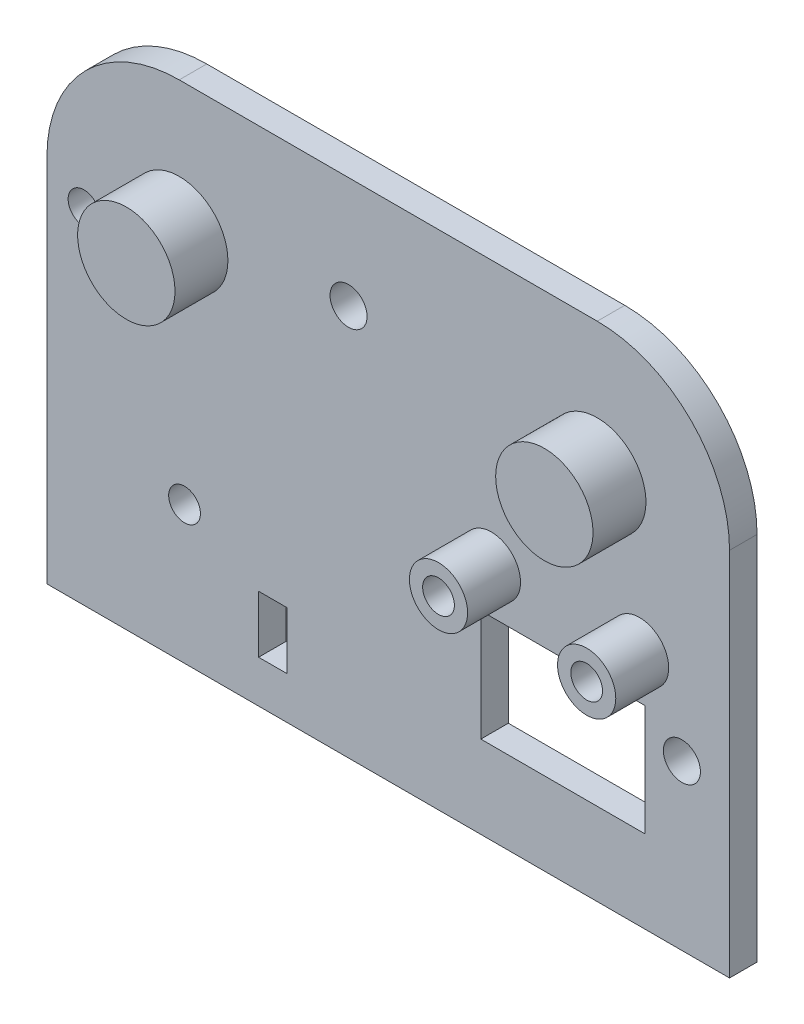
ISO-10303-21;
HEADER;
FILE_DESCRIPTION(('STEP AP214'),'2;1');
FILE_NAME('part.step','',(''),(''),'','','');
FILE_SCHEMA(('AUTOMOTIVE_DESIGN { 1 0 10303 214 1 1 1 1 }'));
ENDSEC;
DATA;
#1=APPLICATION_CONTEXT('core data for automotive mechanical design processes');
#2=APPLICATION_PROTOCOL_DEFINITION('international standard','automotive_design',2000,#1);
#3=PRODUCT_CONTEXT('',#1,'mechanical');
#4=PRODUCT('Part','Part','',(#3));
#5=PRODUCT_RELATED_PRODUCT_CATEGORY('part','',(#4));
#6=PRODUCT_DEFINITION_FORMATION('','',#4);
#7=PRODUCT_DEFINITION_CONTEXT('part definition',#1,'design');
#8=PRODUCT_DEFINITION('design','',#6,#7);
#9=PRODUCT_DEFINITION_SHAPE('','',#8);
#10=(LENGTH_UNIT() NAMED_UNIT(*) SI_UNIT(.MILLI.,.METRE.));
#11=(NAMED_UNIT(*) PLANE_ANGLE_UNIT() SI_UNIT($,.RADIAN.));
#12=(NAMED_UNIT(*) SI_UNIT($,.STERADIAN.) SOLID_ANGLE_UNIT());
#13=UNCERTAINTY_MEASURE_WITH_UNIT(LENGTH_MEASURE(1.E-05),#10,'distance_accuracy_value','');
#14=(GEOMETRIC_REPRESENTATION_CONTEXT(3) GLOBAL_UNCERTAINTY_ASSIGNED_CONTEXT((#13)) GLOBAL_UNIT_ASSIGNED_CONTEXT((#10,
#11,#12)) REPRESENTATION_CONTEXT('',''));
#15=CARTESIAN_POINT('',(0.,0.,0.));
#16=DIRECTION('',(0.,0.,1.));
#17=DIRECTION('',(1.,0.,0.));
#18=AXIS2_PLACEMENT_3D('',#15,#16,#17);
#19=CARTESIAN_POINT('',(-32.25,23.75,2.6));
#20=DIRECTION('',(1.,0.,0.));
#21=DIRECTION('',(0.,0.,-1.));
#22=AXIS2_PLACEMENT_3D('',#19,#20,#21);
#23=PLANE('',#22);
#24=DIRECTION('',(0.,-1.,0.));
#25=VECTOR('',#24,1.);
#26=CARTESIAN_POINT('',(-32.25,23.75,2.6));
#27=LINE('',#26,#25);
#28=CARTESIAN_POINT('',(-32.25,11.25,2.6));
#29=VERTEX_POINT('',#28);
#30=CARTESIAN_POINT('',(-32.25,-23.75,2.6));
#31=VERTEX_POINT('',#30);
#32=EDGE_CURVE('E229',#29,#31,#27,.T.);
#33=ORIENTED_EDGE('',*,*,#32,.F.);
#34=DIRECTION('',(0.,0.,-1.));
#35=VECTOR('',#34,1.);
#36=CARTESIAN_POINT('',(-32.25,11.25,2.6));
#37=LINE('',#36,#35);
#38=CARTESIAN_POINT('',(-32.25,11.25,0.));
#39=VERTEX_POINT('',#38);
#40=EDGE_CURVE('E11',#29,#39,#37,.T.);
#41=ORIENTED_EDGE('',*,*,#40,.T.);
#42=DIRECTION('',(0.,-1.,0.));
#43=VECTOR('',#42,1.);
#44=CARTESIAN_POINT('',(-32.25,23.75,0.));
#45=LINE('',#44,#43);
#46=CARTESIAN_POINT('',(-32.25,-23.75,0.));
#47=VERTEX_POINT('',#46);
#48=EDGE_CURVE('E226',#39,#47,#45,.T.);
#49=ORIENTED_EDGE('',*,*,#48,.T.);
#50=DIRECTION('',(0.,0.,-1.));
#51=VECTOR('',#50,1.);
#52=CARTESIAN_POINT('',(-32.25,-23.75,2.6));
#53=LINE('',#52,#51);
#54=EDGE_CURVE('E251',#31,#47,#53,.T.);
#55=ORIENTED_EDGE('',*,*,#54,.F.);
#56=EDGE_LOOP('',(#33,#41,#49,#55));
#57=FACE_BOUND('',#56,.T.);
#58=ADVANCED_FACE('F41',(#57),#23,.F.);
#59=CARTESIAN_POINT('',(-32.25,-23.75,2.6));
#60=DIRECTION('',(0.,1.,0.));
#61=DIRECTION('',(0.,0.,1.));
#62=AXIS2_PLACEMENT_3D('',#59,#60,#61);
#63=PLANE('',#62);
#64=DIRECTION('',(1.,0.,0.));
#65=VECTOR('',#64,1.);
#66=CARTESIAN_POINT('',(-32.25,-23.75,0.));
#67=LINE('',#66,#65);
#68=CARTESIAN_POINT('',(32.25,-23.75,0.));
#69=VERTEX_POINT('',#68);
#70=EDGE_CURVE('E242',#47,#69,#67,.T.);
#71=ORIENTED_EDGE('',*,*,#70,.T.);
#72=DIRECTION('',(0.,0.,-1.));
#73=VECTOR('',#72,1.);
#74=CARTESIAN_POINT('',(32.25,-23.75,2.6));
#75=LINE('',#74,#73);
#76=CARTESIAN_POINT('',(32.25,-23.75,2.6));
#77=VERTEX_POINT('',#76);
#78=EDGE_CURVE('E240',#77,#69,#75,.T.);
#79=ORIENTED_EDGE('',*,*,#78,.F.);
#80=DIRECTION('',(1.,0.,0.));
#81=VECTOR('',#80,1.);
#82=CARTESIAN_POINT('',(-32.25,-23.75,2.6));
#83=LINE('',#82,#81);
#84=EDGE_CURVE('E231',#31,#77,#83,.T.);
#85=ORIENTED_EDGE('',*,*,#84,.F.);
#86=ORIENTED_EDGE('',*,*,#54,.T.);
#87=EDGE_LOOP('',(#71,#79,#85,#86));
#88=FACE_BOUND('',#87,.T.);
#89=ADVANCED_FACE('F355',(#88),#63,.F.);
#90=CARTESIAN_POINT('',(32.25,23.75,2.6));
#91=DIRECTION('',(-1.,0.,0.));
#92=DIRECTION('',(0.,-1.,0.));
#93=AXIS2_PLACEMENT_3D('',#90,#91,#92);
#94=PLANE('',#93);
#95=DIRECTION('',(0.,1.,0.));
#96=VECTOR('',#95,1.);
#97=CARTESIAN_POINT('',(32.25,23.75,0.));
#98=LINE('',#97,#96);
#99=CARTESIAN_POINT('',(32.25,11.25,0.));
#100=VERTEX_POINT('',#99);
#101=EDGE_CURVE('E244',#69,#100,#98,.T.);
#102=ORIENTED_EDGE('',*,*,#101,.T.);
#103=DIRECTION('',(0.,0.,-1.));
#104=VECTOR('',#103,1.);
#105=CARTESIAN_POINT('',(32.25,11.25,2.6));
#106=LINE('',#105,#104);
#107=CARTESIAN_POINT('',(32.25,11.25,2.6));
#108=VERTEX_POINT('',#107);
#109=EDGE_CURVE('E263',#100,#108,#106,.F.);
#110=ORIENTED_EDGE('',*,*,#109,.T.);
#111=DIRECTION('',(0.,1.,0.));
#112=VECTOR('',#111,1.);
#113=CARTESIAN_POINT('',(32.25,23.75,2.6));
#114=LINE('',#113,#112);
#115=EDGE_CURVE('E234',#77,#108,#114,.T.);
#116=ORIENTED_EDGE('',*,*,#115,.F.);
#117=ORIENTED_EDGE('',*,*,#78,.T.);
#118=EDGE_LOOP('',(#102,#110,#116,#117));
#119=FACE_BOUND('',#118,.T.);
#120=ADVANCED_FACE('F362',(#119),#94,.F.);
#121=CARTESIAN_POINT('',(-32.25,23.75,2.6));
#122=DIRECTION('',(0.,-1.,0.));
#123=DIRECTION('',(0.,0.,-1.));
#124=AXIS2_PLACEMENT_3D('',#121,#122,#123);
#125=PLANE('',#124);
#126=DIRECTION('',(-1.,0.,0.));
#127=VECTOR('',#126,1.);
#128=CARTESIAN_POINT('',(-32.25,23.75,2.6));
#129=LINE('',#128,#127);
#130=CARTESIAN_POINT('',(19.75,23.75,2.6));
#131=VERTEX_POINT('',#130);
#132=CARTESIAN_POINT('',(-19.75,23.75,2.6));
#133=VERTEX_POINT('',#132);
#134=EDGE_CURVE('E237',#131,#133,#129,.T.);
#135=ORIENTED_EDGE('',*,*,#134,.F.);
#136=DIRECTION('',(0.,0.,-1.));
#137=VECTOR('',#136,1.);
#138=CARTESIAN_POINT('',(19.75,23.75,2.6));
#139=LINE('',#138,#137);
#140=CARTESIAN_POINT('',(19.75,23.75,0.));
#141=VERTEX_POINT('',#140);
#142=EDGE_CURVE('E256',#131,#141,#139,.T.);
#143=ORIENTED_EDGE('',*,*,#142,.T.);
#144=DIRECTION('',(-1.,0.,0.));
#145=VECTOR('',#144,1.);
#146=CARTESIAN_POINT('',(-32.25,23.75,0.));
#147=LINE('',#146,#145);
#148=CARTESIAN_POINT('',(-19.75,23.75,0.));
#149=VERTEX_POINT('',#148);
#150=EDGE_CURVE('E232',#141,#149,#147,.T.);
#151=ORIENTED_EDGE('',*,*,#150,.T.);
#152=DIRECTION('',(0.,0.,-1.));
#153=VECTOR('',#152,1.);
#154=CARTESIAN_POINT('',(-19.75,23.75,2.6));
#155=LINE('',#154,#153);
#156=EDGE_CURVE('E254',#149,#133,#155,.F.);
#157=ORIENTED_EDGE('',*,*,#156,.T.);
#158=EDGE_LOOP('',(#135,#143,#151,#157));
#159=FACE_BOUND('',#158,.T.);
#160=ADVANCED_FACE('F343',(#159),#125,.F.);
#161=CARTESIAN_POINT('',(0.,0.,2.6));
#162=DIRECTION('',(0.,0.,1.));
#163=DIRECTION('',(1.,0.,0.));
#164=AXIS2_PLACEMENT_3D('',#161,#162,#163);
#165=PLANE('',#164);
#166=CARTESIAN_POINT('',(-19.75,11.25,2.6));
#167=DIRECTION('',(0.,0.,1.));
#168=DIRECTION('',(1.,0.,0.));
#169=AXIS2_PLACEMENT_3D('',#166,#167,#168);
#170=CIRCLE('',#169,4.6);
#171=CARTESIAN_POINT('',(-15.15,11.25,2.6));
#172=VERTEX_POINT('',#171);
#173=EDGE_CURVE('E288',#172,#172,#170,.T.);
#174=ORIENTED_EDGE('',*,*,#173,.F.);
#175=EDGE_LOOP('',(#174));
#176=FACE_BOUND('',#175,.T.);
#177=CARTESIAN_POINT('',(23.75,-1.25,2.6));
#178=DIRECTION('',(0.,0.,1.));
#179=DIRECTION('',(1.,0.,0.));
#180=AXIS2_PLACEMENT_3D('',#177,#178,#179);
#181=CIRCLE('',#180,2.75);
#182=CARTESIAN_POINT('',(26.5,-1.25,2.6));
#183=VERTEX_POINT('',#182);
#184=EDGE_CURVE('E276',#183,#183,#181,.T.);
#185=ORIENTED_EDGE('',*,*,#184,.F.);
#186=EDGE_LOOP('',(#185));
#187=FACE_BOUND('',#186,.T.);
#188=CARTESIAN_POINT('',(9.75000000000001,-1.25,2.6));
#189=DIRECTION('',(0.,0.,1.));
#190=DIRECTION('',(1.,0.,0.));
#191=AXIS2_PLACEMENT_3D('',#188,#189,#190);
#192=CIRCLE('',#191,2.75);
#193=CARTESIAN_POINT('',(12.5,-1.25,2.6));
#194=VERTEX_POINT('',#193);
#195=EDGE_CURVE('E292',#194,#194,#192,.T.);
#196=ORIENTED_EDGE('',*,*,#195,.F.);
#197=EDGE_LOOP('',(#196));
#198=FACE_BOUND('',#197,.T.);
#199=CARTESIAN_POINT('',(19.75,11.25,2.6));
#200=DIRECTION('',(0.,0.,1.));
#201=DIRECTION('',(-1.,0.,0.));
#202=AXIS2_PLACEMENT_3D('',#199,#200,#201);
#203=CIRCLE('',#202,4.6);
#204=CARTESIAN_POINT('',(15.15,11.25,2.6));
#205=VERTEX_POINT('',#204);
#206=EDGE_CURVE('E285',#205,#205,#203,.T.);
#207=ORIENTED_EDGE('',*,*,#206,.F.);
#208=EDGE_LOOP('',(#207));
#209=FACE_BOUND('',#208,.T.);
#210=CARTESIAN_POINT('',(27.75,-8.25,2.6));
#211=DIRECTION('',(0.,0.,1.));
#212=DIRECTION('',(1.,0.,0.));
#213=AXIS2_PLACEMENT_3D('',#210,#211,#212);
#214=CIRCLE('',#213,1.75);
#215=CARTESIAN_POINT('',(29.5,-8.25,2.6));
#216=VERTEX_POINT('',#215);
#217=EDGE_CURVE('E151',#216,#216,#214,.T.);
#218=ORIENTED_EDGE('',*,*,#217,.F.);
#219=EDGE_LOOP('',(#218));
#220=FACE_BOUND('',#219,.T.);
#221=DIRECTION('',(0.,-1.,0.));
#222=VECTOR('',#221,1.);
#223=CARTESIAN_POINT('',(-12.25,-14.35,2.6));
#224=LINE('',#223,#222);
#225=CARTESIAN_POINT('',(-12.25,-14.35,2.6));
#226=VERTEX_POINT('',#225);
#227=CARTESIAN_POINT('',(-12.25,-19.75,2.6));
#228=VERTEX_POINT('',#227);
#229=EDGE_CURVE('E58',#226,#228,#224,.T.);
#230=ORIENTED_EDGE('',*,*,#229,.F.);
#231=DIRECTION('',(-1.,0.,0.));
#232=VECTOR('',#231,1.);
#233=CARTESIAN_POINT('',(-12.25,-14.35,2.6));
#234=LINE('',#233,#232);
#235=CARTESIAN_POINT('',(-9.55,-14.35,2.6));
#236=VERTEX_POINT('',#235);
#237=EDGE_CURVE('E154',#236,#226,#234,.T.);
#238=ORIENTED_EDGE('',*,*,#237,.F.);
#239=DIRECTION('',(0.,1.,0.));
#240=VECTOR('',#239,1.);
#241=CARTESIAN_POINT('',(-9.55,-14.35,2.6));
#242=LINE('',#241,#240);
#243=CARTESIAN_POINT('',(-9.55,-19.75,2.6));
#244=VERTEX_POINT('',#243);
#245=EDGE_CURVE('E159',#244,#236,#242,.T.);
#246=ORIENTED_EDGE('',*,*,#245,.F.);
#247=DIRECTION('',(1.,0.,0.));
#248=VECTOR('',#247,1.);
#249=CARTESIAN_POINT('',(-12.25,-19.75,2.6));
#250=LINE('',#249,#248);
#251=EDGE_CURVE('E165',#228,#244,#250,.T.);
#252=ORIENTED_EDGE('',*,*,#251,.F.);
#253=EDGE_LOOP('',(#230,#238,#246,#252));
#254=FACE_BOUND('',#253,.T.);
#255=DIRECTION('',(0.,-1.,0.));
#256=VECTOR('',#255,1.);
#257=CARTESIAN_POINT('',(8.75000000000001,-5.45,2.6));
#258=LINE('',#257,#256);
#259=CARTESIAN_POINT('',(8.75000000000001,-5.45,2.6));
#260=VERTEX_POINT('',#259);
#261=CARTESIAN_POINT('',(8.75000000000001,-15.95,2.6));
#262=VERTEX_POINT('',#261);
#263=EDGE_CURVE('E66',#260,#262,#258,.T.);
#264=ORIENTED_EDGE('',*,*,#263,.F.);
#265=DIRECTION('',(-1.,0.,0.));
#266=VECTOR('',#265,1.);
#267=CARTESIAN_POINT('',(8.75000000000001,-5.45,2.6));
#268=LINE('',#267,#266);
#269=CARTESIAN_POINT('',(24.25,-5.45,2.6));
#270=VERTEX_POINT('',#269);
#271=EDGE_CURVE('E202',#270,#260,#268,.T.);
#272=ORIENTED_EDGE('',*,*,#271,.F.);
#273=DIRECTION('',(0.,1.,0.));
#274=VECTOR('',#273,1.);
#275=CARTESIAN_POINT('',(24.25,-5.45,2.6));
#276=LINE('',#275,#274);
#277=CARTESIAN_POINT('',(24.25,-15.95,2.6));
#278=VERTEX_POINT('',#277);
#279=EDGE_CURVE('E205',#278,#270,#276,.T.);
#280=ORIENTED_EDGE('',*,*,#279,.F.);
#281=DIRECTION('',(1.,0.,0.));
#282=VECTOR('',#281,1.);
#283=CARTESIAN_POINT('',(8.75000000000001,-15.95,2.6));
#284=LINE('',#283,#282);
#285=EDGE_CURVE('E209',#262,#278,#284,.T.);
#286=ORIENTED_EDGE('',*,*,#285,.F.);
#287=EDGE_LOOP('',(#264,#272,#280,#286));
#288=FACE_BOUND('',#287,.T.);
#289=CARTESIAN_POINT('',(-28.75,8.75,2.6));
#290=DIRECTION('',(0.,0.,1.));
#291=DIRECTION('',(1.,0.,0.));
#292=AXIS2_PLACEMENT_3D('',#289,#290,#291);
#293=CIRCLE('',#292,1.5);
#294=CARTESIAN_POINT('',(-27.25,8.75,2.6));
#295=VERTEX_POINT('',#294);
#296=EDGE_CURVE('E189',#295,#295,#293,.T.);
#297=ORIENTED_EDGE('',*,*,#296,.F.);
#298=EDGE_LOOP('',(#297));
#299=FACE_BOUND('',#298,.T.);
#300=CARTESIAN_POINT('',(-3.74999999999999,13.25,2.6));
#301=DIRECTION('',(0.,0.,1.));
#302=DIRECTION('',(1.,0.,0.));
#303=AXIS2_PLACEMENT_3D('',#300,#301,#302);
#304=CIRCLE('',#303,1.75);
#305=CARTESIAN_POINT('',(-1.99999999999999,13.25,2.6));
#306=VERTEX_POINT('',#305);
#307=EDGE_CURVE('E302',#306,#306,#304,.T.);
#308=ORIENTED_EDGE('',*,*,#307,.F.);
#309=EDGE_LOOP('',(#308));
#310=FACE_BOUND('',#309,.T.);
#311=CARTESIAN_POINT('',(-19.25,-10.75,2.6));
#312=DIRECTION('',(0.,0.,1.));
#313=DIRECTION('',(1.,0.,0.));
#314=AXIS2_PLACEMENT_3D('',#311,#312,#313);
#315=CIRCLE('',#314,1.5);
#316=CARTESIAN_POINT('',(-17.75,-10.75,2.6));
#317=VERTEX_POINT('',#316);
#318=EDGE_CURVE('E192',#317,#317,#315,.T.);
#319=ORIENTED_EDGE('',*,*,#318,.F.);
#320=EDGE_LOOP('',(#319));
#321=FACE_BOUND('',#320,.T.);
#322=ORIENTED_EDGE('',*,*,#115,.T.);
#323=CARTESIAN_POINT('',(19.75,11.25,2.6));
#324=DIRECTION('',(0.,0.,1.));
#325=DIRECTION('',(1.,0.,0.));
#326=AXIS2_PLACEMENT_3D('',#323,#324,#325);
#327=CIRCLE('',#326,12.5);
#328=EDGE_CURVE('E50',#108,#131,#327,.T.);
#329=ORIENTED_EDGE('',*,*,#328,.T.);
#330=ORIENTED_EDGE('',*,*,#134,.T.);
#331=CARTESIAN_POINT('',(-19.75,11.25,2.6));
#332=DIRECTION('',(0.,0.,1.));
#333=DIRECTION('',(1.,0.,0.));
#334=AXIS2_PLACEMENT_3D('',#331,#332,#333);
#335=CIRCLE('',#334,12.5);
#336=EDGE_CURVE('E265',#133,#29,#335,.T.);
#337=ORIENTED_EDGE('',*,*,#336,.T.);
#338=ORIENTED_EDGE('',*,*,#32,.T.);
#339=ORIENTED_EDGE('',*,*,#84,.T.);
#340=EDGE_LOOP('',(#322,#329,#330,#337,#338,#339));
#341=FACE_BOUND('',#340,.T.);
#342=ADVANCED_FACE('F162',(#176,#187,#198,#209,#220,#254,#288,#299,#310,#321,#341),#165,.T.);
#343=CARTESIAN_POINT('',(0.,0.,0.));
#344=DIRECTION('',(0.,0.,1.));
#345=DIRECTION('',(1.,0.,0.));
#346=AXIS2_PLACEMENT_3D('',#343,#344,#345);
#347=PLANE('',#346);
#348=CARTESIAN_POINT('',(27.75,-8.25,0.));
#349=DIRECTION('',(0.,0.,1.));
#350=DIRECTION('',(1.,0.,0.));
#351=AXIS2_PLACEMENT_3D('',#348,#349,#350);
#352=CIRCLE('',#351,1.75);
#353=CARTESIAN_POINT('',(29.5,-8.25,0.));
#354=VERTEX_POINT('',#353);
#355=EDGE_CURVE('E185',#354,#354,#352,.T.);
#356=ORIENTED_EDGE('',*,*,#355,.T.);
#357=EDGE_LOOP('',(#356));
#358=FACE_BOUND('',#357,.T.);
#359=DIRECTION('',(-1.,0.,0.));
#360=VECTOR('',#359,1.);
#361=CARTESIAN_POINT('',(-12.25,-14.35,0.));
#362=LINE('',#361,#360);
#363=CARTESIAN_POINT('',(-9.55,-14.35,0.));
#364=VERTEX_POINT('',#363);
#365=CARTESIAN_POINT('',(-12.25,-14.35,0.));
#366=VERTEX_POINT('',#365);
#367=EDGE_CURVE('E173',#364,#366,#362,.T.);
#368=ORIENTED_EDGE('',*,*,#367,.T.);
#369=DIRECTION('',(0.,-1.,0.));
#370=VECTOR('',#369,1.);
#371=CARTESIAN_POINT('',(-12.25,-14.35,0.));
#372=LINE('',#371,#370);
#373=CARTESIAN_POINT('',(-12.25,-19.75,0.));
#374=VERTEX_POINT('',#373);
#375=EDGE_CURVE('E146',#366,#374,#372,.T.);
#376=ORIENTED_EDGE('',*,*,#375,.T.);
#377=DIRECTION('',(1.,0.,0.));
#378=VECTOR('',#377,1.);
#379=CARTESIAN_POINT('',(-12.25,-19.75,0.));
#380=LINE('',#379,#378);
#381=CARTESIAN_POINT('',(-9.55,-19.75,0.));
#382=VERTEX_POINT('',#381);
#383=EDGE_CURVE('E179',#374,#382,#380,.T.);
#384=ORIENTED_EDGE('',*,*,#383,.T.);
#385=DIRECTION('',(0.,1.,0.));
#386=VECTOR('',#385,1.);
#387=CARTESIAN_POINT('',(-9.55,-14.35,0.));
#388=LINE('',#387,#386);
#389=EDGE_CURVE('E175',#382,#364,#388,.T.);
#390=ORIENTED_EDGE('',*,*,#389,.T.);
#391=EDGE_LOOP('',(#368,#376,#384,#390));
#392=FACE_BOUND('',#391,.T.);
#393=DIRECTION('',(-1.,0.,0.));
#394=VECTOR('',#393,1.);
#395=CARTESIAN_POINT('',(8.75000000000001,-5.45,0.));
#396=LINE('',#395,#394);
#397=CARTESIAN_POINT('',(24.25,-5.45,0.));
#398=VERTEX_POINT('',#397);
#399=CARTESIAN_POINT('',(8.75000000000001,-5.45,0.));
#400=VERTEX_POINT('',#399);
#401=EDGE_CURVE('E198',#398,#400,#396,.T.);
#402=ORIENTED_EDGE('',*,*,#401,.T.);
#403=DIRECTION('',(0.,-1.,0.));
#404=VECTOR('',#403,1.);
#405=CARTESIAN_POINT('',(8.75000000000001,-5.45,0.));
#406=LINE('',#405,#404);
#407=CARTESIAN_POINT('',(8.75000000000001,-15.95,0.));
#408=VERTEX_POINT('',#407);
#409=EDGE_CURVE('E206',#400,#408,#406,.T.);
#410=ORIENTED_EDGE('',*,*,#409,.T.);
#411=DIRECTION('',(1.,0.,0.));
#412=VECTOR('',#411,1.);
#413=CARTESIAN_POINT('',(8.75000000000001,-15.95,0.));
#414=LINE('',#413,#412);
#415=CARTESIAN_POINT('',(24.25,-15.95,0.));
#416=VERTEX_POINT('',#415);
#417=EDGE_CURVE('E218',#408,#416,#414,.T.);
#418=ORIENTED_EDGE('',*,*,#417,.T.);
#419=DIRECTION('',(0.,1.,0.));
#420=VECTOR('',#419,1.);
#421=CARTESIAN_POINT('',(24.25,-5.45,0.));
#422=LINE('',#421,#420);
#423=EDGE_CURVE('E215',#416,#398,#422,.T.);
#424=ORIENTED_EDGE('',*,*,#423,.T.);
#425=EDGE_LOOP('',(#402,#410,#418,#424));
#426=FACE_BOUND('',#425,.T.);
#427=CARTESIAN_POINT('',(-28.75,8.75,0.));
#428=DIRECTION('',(0.,0.,1.));
#429=DIRECTION('',(1.,0.,0.));
#430=AXIS2_PLACEMENT_3D('',#427,#428,#429);
#431=CIRCLE('',#430,1.5);
#432=CARTESIAN_POINT('',(-27.25,8.75,0.));
#433=VERTEX_POINT('',#432);
#434=EDGE_CURVE('E193',#433,#433,#431,.T.);
#435=ORIENTED_EDGE('',*,*,#434,.T.);
#436=EDGE_LOOP('',(#435));
#437=FACE_BOUND('',#436,.T.);
#438=CARTESIAN_POINT('',(23.75,-1.25,0.));
#439=DIRECTION('',(0.,0.,1.));
#440=DIRECTION('',(1.,0.,0.));
#441=AXIS2_PLACEMENT_3D('',#438,#439,#440);
#442=CIRCLE('',#441,1.5);
#443=CARTESIAN_POINT('',(25.25,-1.25,0.));
#444=VERTEX_POINT('',#443);
#445=EDGE_CURVE('E188',#444,#444,#442,.T.);
#446=ORIENTED_EDGE('',*,*,#445,.T.);
#447=EDGE_LOOP('',(#446));
#448=FACE_BOUND('',#447,.T.);
#449=CARTESIAN_POINT('',(9.75000000000001,-1.25,0.));
#450=DIRECTION('',(0.,0.,1.));
#451=DIRECTION('',(1.,0.,0.));
#452=AXIS2_PLACEMENT_3D('',#449,#450,#451);
#453=CIRCLE('',#452,1.5);
#454=CARTESIAN_POINT('',(11.25,-1.25,0.));
#455=VERTEX_POINT('',#454);
#456=EDGE_CURVE('E299',#455,#455,#453,.T.);
#457=ORIENTED_EDGE('',*,*,#456,.T.);
#458=EDGE_LOOP('',(#457));
#459=FACE_BOUND('',#458,.T.);
#460=CARTESIAN_POINT('',(-3.74999999999999,13.25,0.));
#461=DIRECTION('',(0.,0.,1.));
#462=DIRECTION('',(1.,0.,0.));
#463=AXIS2_PLACEMENT_3D('',#460,#461,#462);
#464=CIRCLE('',#463,1.75);
#465=CARTESIAN_POINT('',(-1.99999999999999,13.25,0.));
#466=VERTEX_POINT('',#465);
#467=EDGE_CURVE('E305',#466,#466,#464,.T.);
#468=ORIENTED_EDGE('',*,*,#467,.T.);
#469=EDGE_LOOP('',(#468));
#470=FACE_BOUND('',#469,.T.);
#471=CARTESIAN_POINT('',(-19.25,-10.75,0.));
#472=DIRECTION('',(0.,0.,1.));
#473=DIRECTION('',(1.,0.,0.));
#474=AXIS2_PLACEMENT_3D('',#471,#472,#473);
#475=CIRCLE('',#474,1.5);
#476=CARTESIAN_POINT('',(-17.75,-10.75,0.));
#477=VERTEX_POINT('',#476);
#478=EDGE_CURVE('E223',#477,#477,#475,.T.);
#479=ORIENTED_EDGE('',*,*,#478,.T.);
#480=EDGE_LOOP('',(#479));
#481=FACE_BOUND('',#480,.T.);
#482=ORIENTED_EDGE('',*,*,#150,.F.);
#483=CARTESIAN_POINT('',(19.75,11.25,0.));
#484=DIRECTION('',(0.,0.,1.));
#485=DIRECTION('',(1.,0.,0.));
#486=AXIS2_PLACEMENT_3D('',#483,#484,#485);
#487=CIRCLE('',#486,12.5);
#488=EDGE_CURVE('E261',#141,#100,#487,.F.);
#489=ORIENTED_EDGE('',*,*,#488,.T.);
#490=ORIENTED_EDGE('',*,*,#101,.F.);
#491=ORIENTED_EDGE('',*,*,#70,.F.);
#492=ORIENTED_EDGE('',*,*,#48,.F.);
#493=CARTESIAN_POINT('',(-19.75,11.25,0.));
#494=DIRECTION('',(0.,0.,1.));
#495=DIRECTION('',(1.,0.,0.));
#496=AXIS2_PLACEMENT_3D('',#493,#494,#495);
#497=CIRCLE('',#496,12.5);
#498=EDGE_CURVE('E259',#39,#149,#497,.F.);
#499=ORIENTED_EDGE('',*,*,#498,.T.);
#500=EDGE_LOOP('',(#482,#489,#490,#491,#492,#499));
#501=FACE_BOUND('',#500,.T.);
#502=ADVANCED_FACE('F319',(#358,#392,#426,#437,#448,#459,#470,#481,#501),#347,.F.);
#503=CARTESIAN_POINT('',(19.75,11.25,2.6));
#504=DIRECTION('',(0.,0.,-1.));
#505=DIRECTION('',(-1.,0.,0.));
#506=AXIS2_PLACEMENT_3D('',#503,#504,#505);
#507=CYLINDRICAL_SURFACE('',#506,12.5);
#508=ORIENTED_EDGE('',*,*,#328,.F.);
#509=ORIENTED_EDGE('',*,*,#109,.F.);
#510=ORIENTED_EDGE('',*,*,#488,.F.);
#511=ORIENTED_EDGE('',*,*,#142,.F.);
#512=EDGE_LOOP('',(#508,#509,#510,#511));
#513=FACE_BOUND('',#512,.T.);
#514=ADVANCED_FACE('F322',(#513),#507,.T.);
#515=CARTESIAN_POINT('',(-19.75,11.25,2.6));
#516=DIRECTION('',(0.,0.,-1.));
#517=DIRECTION('',(-1.,0.,0.));
#518=AXIS2_PLACEMENT_3D('',#515,#516,#517);
#519=CYLINDRICAL_SURFACE('',#518,12.5);
#520=ORIENTED_EDGE('',*,*,#336,.F.);
#521=ORIENTED_EDGE('',*,*,#156,.F.);
#522=ORIENTED_EDGE('',*,*,#498,.F.);
#523=ORIENTED_EDGE('',*,*,#40,.F.);
#524=EDGE_LOOP('',(#520,#521,#522,#523));
#525=FACE_BOUND('',#524,.T.);
#526=ADVANCED_FACE('F43',(#525),#519,.T.);
#527=CARTESIAN_POINT('',(-19.25,-10.75,0.));
#528=DIRECTION('',(0.,0.,1.));
#529=DIRECTION('',(1.,0.,0.));
#530=AXIS2_PLACEMENT_3D('',#527,#528,#529);
#531=CYLINDRICAL_SURFACE('',#530,1.5);
#532=ORIENTED_EDGE('',*,*,#478,.F.);
#533=EDGE_LOOP('',(#532));
#534=FACE_BOUND('',#533,.T.);
#535=ORIENTED_EDGE('',*,*,#318,.T.);
#536=EDGE_LOOP('',(#535));
#537=FACE_BOUND('',#536,.T.);
#538=ADVANCED_FACE('F379',(#534,#537),#531,.F.);
#539=CARTESIAN_POINT('',(-3.74999999999999,13.25,0.));
#540=DIRECTION('',(0.,0.,1.));
#541=DIRECTION('',(1.,0.,0.));
#542=AXIS2_PLACEMENT_3D('',#539,#540,#541);
#543=CYLINDRICAL_SURFACE('',#542,1.75);
#544=ORIENTED_EDGE('',*,*,#467,.F.);
#545=EDGE_LOOP('',(#544));
#546=FACE_BOUND('',#545,.T.);
#547=ORIENTED_EDGE('',*,*,#307,.T.);
#548=EDGE_LOOP('',(#547));
#549=FACE_BOUND('',#548,.T.);
#550=ADVANCED_FACE('F383',(#546,#549),#543,.F.);
#551=CARTESIAN_POINT('',(9.75000000000001,-1.25,0.));
#552=DIRECTION('',(0.,0.,1.));
#553=DIRECTION('',(1.,0.,0.));
#554=AXIS2_PLACEMENT_3D('',#551,#552,#553);
#555=CYLINDRICAL_SURFACE('',#554,1.5);
#556=ORIENTED_EDGE('',*,*,#456,.F.);
#557=EDGE_LOOP('',(#556));
#558=FACE_BOUND('',#557,.T.);
#559=CARTESIAN_POINT('',(9.75000000000001,-1.25,7.6));
#560=DIRECTION('',(0.,0.,1.));
#561=DIRECTION('',(1.,0.,0.));
#562=AXIS2_PLACEMENT_3D('',#559,#560,#561);
#563=CIRCLE('',#562,1.5);
#564=CARTESIAN_POINT('',(11.25,-1.25,7.6));
#565=VERTEX_POINT('',#564);
#566=EDGE_CURVE('E45',#565,#565,#563,.T.);
#567=ORIENTED_EDGE('',*,*,#566,.T.);
#568=EDGE_LOOP('',(#567));
#569=FACE_BOUND('',#568,.T.);
#570=ADVANCED_FACE('F389',(#558,#569),#555,.F.);
#571=CARTESIAN_POINT('',(23.75,-1.25,0.));
#572=DIRECTION('',(0.,0.,1.));
#573=DIRECTION('',(1.,0.,0.));
#574=AXIS2_PLACEMENT_3D('',#571,#572,#573);
#575=CYLINDRICAL_SURFACE('',#574,1.5);
#576=ORIENTED_EDGE('',*,*,#445,.F.);
#577=EDGE_LOOP('',(#576));
#578=FACE_BOUND('',#577,.T.);
#579=CARTESIAN_POINT('',(23.75,-1.25,7.6));
#580=DIRECTION('',(0.,0.,1.));
#581=DIRECTION('',(1.,0.,0.));
#582=AXIS2_PLACEMENT_3D('',#579,#580,#581);
#583=CIRCLE('',#582,1.5);
#584=CARTESIAN_POINT('',(25.25,-1.25,7.6));
#585=VERTEX_POINT('',#584);
#586=EDGE_CURVE('E267',#585,#585,#583,.T.);
#587=ORIENTED_EDGE('',*,*,#586,.T.);
#588=EDGE_LOOP('',(#587));
#589=FACE_BOUND('',#588,.T.);
#590=ADVANCED_FACE('F433',(#578,#589),#575,.F.);
#591=CARTESIAN_POINT('',(-28.75,8.75,0.));
#592=DIRECTION('',(0.,0.,1.));
#593=DIRECTION('',(1.,0.,0.));
#594=AXIS2_PLACEMENT_3D('',#591,#592,#593);
#595=CYLINDRICAL_SURFACE('',#594,1.5);
#596=ORIENTED_EDGE('',*,*,#434,.F.);
#597=EDGE_LOOP('',(#596));
#598=FACE_BOUND('',#597,.T.);
#599=ORIENTED_EDGE('',*,*,#296,.T.);
#600=EDGE_LOOP('',(#599));
#601=FACE_BOUND('',#600,.T.);
#602=ADVANCED_FACE('F429',(#598,#601),#595,.F.);
#603=CARTESIAN_POINT('',(8.75000000000001,-5.45,0.));
#604=DIRECTION('',(-1.,0.,0.));
#605=DIRECTION('',(0.,-1.,0.));
#606=AXIS2_PLACEMENT_3D('',#603,#604,#605);
#607=PLANE('',#606);
#608=ORIENTED_EDGE('',*,*,#263,.T.);
#609=DIRECTION('',(0.,0.,1.));
#610=VECTOR('',#609,1.);
#611=CARTESIAN_POINT('',(8.75000000000001,-15.95,0.));
#612=LINE('',#611,#610);
#613=EDGE_CURVE('E196',#408,#262,#612,.T.);
#614=ORIENTED_EDGE('',*,*,#613,.F.);
#615=ORIENTED_EDGE('',*,*,#409,.F.);
#616=DIRECTION('',(0.,0.,1.));
#617=VECTOR('',#616,1.);
#618=CARTESIAN_POINT('',(8.75000000000001,-5.45,0.));
#619=LINE('',#618,#617);
#620=EDGE_CURVE('E166',#400,#260,#619,.T.);
#621=ORIENTED_EDGE('',*,*,#620,.T.);
#622=EDGE_LOOP('',(#608,#614,#615,#621));
#623=FACE_BOUND('',#622,.T.);
#624=ADVANCED_FACE('F432',(#623),#607,.F.);
#625=CARTESIAN_POINT('',(8.75000000000001,-5.45,0.));
#626=DIRECTION('',(0.,1.,0.));
#627=DIRECTION('',(0.,0.,1.));
#628=AXIS2_PLACEMENT_3D('',#625,#626,#627);
#629=PLANE('',#628);
#630=ORIENTED_EDGE('',*,*,#271,.T.);
#631=ORIENTED_EDGE('',*,*,#620,.F.);
#632=ORIENTED_EDGE('',*,*,#401,.F.);
#633=DIRECTION('',(0.,0.,1.));
#634=VECTOR('',#633,1.);
#635=CARTESIAN_POINT('',(24.25,-5.45,0.));
#636=LINE('',#635,#634);
#637=EDGE_CURVE('E168',#398,#270,#636,.T.);
#638=ORIENTED_EDGE('',*,*,#637,.T.);
#639=EDGE_LOOP('',(#630,#631,#632,#638));
#640=FACE_BOUND('',#639,.T.);
#641=ADVANCED_FACE('F395',(#640),#629,.F.);
#642=CARTESIAN_POINT('',(24.25,-5.45,0.));
#643=DIRECTION('',(1.,0.,0.));
#644=DIRECTION('',(0.,0.,-1.));
#645=AXIS2_PLACEMENT_3D('',#642,#643,#644);
#646=PLANE('',#645);
#647=ORIENTED_EDGE('',*,*,#279,.T.);
#648=ORIENTED_EDGE('',*,*,#637,.F.);
#649=ORIENTED_EDGE('',*,*,#423,.F.);
#650=DIRECTION('',(0.,0.,1.));
#651=VECTOR('',#650,1.);
#652=CARTESIAN_POINT('',(24.25,-15.95,0.));
#653=LINE('',#652,#651);
#654=EDGE_CURVE('E199',#416,#278,#653,.T.);
#655=ORIENTED_EDGE('',*,*,#654,.T.);
#656=EDGE_LOOP('',(#647,#648,#649,#655));
#657=FACE_BOUND('',#656,.T.);
#658=ADVANCED_FACE('F439',(#657),#646,.F.);
#659=CARTESIAN_POINT('',(8.75000000000001,-15.95,0.));
#660=DIRECTION('',(0.,-1.,0.));
#661=DIRECTION('',(0.,0.,-1.));
#662=AXIS2_PLACEMENT_3D('',#659,#660,#661);
#663=PLANE('',#662);
#664=ORIENTED_EDGE('',*,*,#285,.T.);
#665=ORIENTED_EDGE('',*,*,#654,.F.);
#666=ORIENTED_EDGE('',*,*,#417,.F.);
#667=ORIENTED_EDGE('',*,*,#613,.T.);
#668=EDGE_LOOP('',(#664,#665,#666,#667));
#669=FACE_BOUND('',#668,.T.);
#670=ADVANCED_FACE('F437',(#669),#663,.F.);
#671=CARTESIAN_POINT('',(-12.25,-14.35,0.));
#672=DIRECTION('',(-1.,0.,0.));
#673=DIRECTION('',(0.,-1.,0.));
#674=AXIS2_PLACEMENT_3D('',#671,#672,#673);
#675=PLANE('',#674);
#676=ORIENTED_EDGE('',*,*,#229,.T.);
#677=DIRECTION('',(0.,0.,1.));
#678=VECTOR('',#677,1.);
#679=CARTESIAN_POINT('',(-12.25,-19.75,0.));
#680=LINE('',#679,#678);
#681=EDGE_CURVE('E176',#374,#228,#680,.T.);
#682=ORIENTED_EDGE('',*,*,#681,.F.);
#683=ORIENTED_EDGE('',*,*,#375,.F.);
#684=DIRECTION('',(0.,0.,1.));
#685=VECTOR('',#684,1.);
#686=CARTESIAN_POINT('',(-12.25,-14.35,0.));
#687=LINE('',#686,#685);
#688=EDGE_CURVE('E142',#366,#226,#687,.T.);
#689=ORIENTED_EDGE('',*,*,#688,.T.);
#690=EDGE_LOOP('',(#676,#682,#683,#689));
#691=FACE_BOUND('',#690,.T.);
#692=ADVANCED_FACE('F144',(#691),#675,.F.);
#693=CARTESIAN_POINT('',(-12.25,-14.35,0.));
#694=DIRECTION('',(0.,1.,0.));
#695=DIRECTION('',(0.,0.,1.));
#696=AXIS2_PLACEMENT_3D('',#693,#694,#695);
#697=PLANE('',#696);
#698=ORIENTED_EDGE('',*,*,#237,.T.);
#699=ORIENTED_EDGE('',*,*,#688,.F.);
#700=ORIENTED_EDGE('',*,*,#367,.F.);
#701=DIRECTION('',(0.,0.,1.));
#702=VECTOR('',#701,1.);
#703=CARTESIAN_POINT('',(-9.55,-14.35,0.));
#704=LINE('',#703,#702);
#705=EDGE_CURVE('E150',#364,#236,#704,.T.);
#706=ORIENTED_EDGE('',*,*,#705,.T.);
#707=EDGE_LOOP('',(#698,#699,#700,#706));
#708=FACE_BOUND('',#707,.T.);
#709=ADVANCED_FACE('F155',(#708),#697,.F.);
#710=CARTESIAN_POINT('',(-9.55,-14.35,0.));
#711=DIRECTION('',(1.,0.,0.));
#712=DIRECTION('',(0.,0.,-1.));
#713=AXIS2_PLACEMENT_3D('',#710,#711,#712);
#714=PLANE('',#713);
#715=ORIENTED_EDGE('',*,*,#245,.T.);
#716=ORIENTED_EDGE('',*,*,#705,.F.);
#717=ORIENTED_EDGE('',*,*,#389,.F.);
#718=DIRECTION('',(0.,0.,1.));
#719=VECTOR('',#718,1.);
#720=CARTESIAN_POINT('',(-9.55,-19.75,0.));
#721=LINE('',#720,#719);
#722=EDGE_CURVE('E310',#382,#244,#721,.T.);
#723=ORIENTED_EDGE('',*,*,#722,.T.);
#724=EDGE_LOOP('',(#715,#716,#717,#723));
#725=FACE_BOUND('',#724,.T.);
#726=ADVANCED_FACE('F313',(#725),#714,.F.);
#727=CARTESIAN_POINT('',(-12.25,-19.75,0.));
#728=DIRECTION('',(0.,-1.,0.));
#729=DIRECTION('',(0.,0.,-1.));
#730=AXIS2_PLACEMENT_3D('',#727,#728,#729);
#731=PLANE('',#730);
#732=ORIENTED_EDGE('',*,*,#251,.T.);
#733=ORIENTED_EDGE('',*,*,#722,.F.);
#734=ORIENTED_EDGE('',*,*,#383,.F.);
#735=ORIENTED_EDGE('',*,*,#681,.T.);
#736=EDGE_LOOP('',(#732,#733,#734,#735));
#737=FACE_BOUND('',#736,.T.);
#738=ADVANCED_FACE('F317',(#737),#731,.F.);
#739=CARTESIAN_POINT('',(27.75,-8.25,0.));
#740=DIRECTION('',(0.,0.,1.));
#741=DIRECTION('',(1.,0.,0.));
#742=AXIS2_PLACEMENT_3D('',#739,#740,#741);
#743=CYLINDRICAL_SURFACE('',#742,1.75);
#744=ORIENTED_EDGE('',*,*,#355,.F.);
#745=EDGE_LOOP('',(#744));
#746=FACE_BOUND('',#745,.T.);
#747=ORIENTED_EDGE('',*,*,#217,.T.);
#748=EDGE_LOOP('',(#747));
#749=FACE_BOUND('',#748,.T.);
#750=ADVANCED_FACE('F414',(#746,#749),#743,.F.);
#751=CARTESIAN_POINT('',(19.75,11.25,7.6));
#752=DIRECTION('',(0.,0.,-1.));
#753=DIRECTION('',(-1.,0.,0.));
#754=AXIS2_PLACEMENT_3D('',#751,#752,#753);
#755=CYLINDRICAL_SURFACE('',#754,4.6);
#756=CARTESIAN_POINT('',(19.75,11.25,7.6));
#757=DIRECTION('',(0.,0.,1.));
#758=DIRECTION('',(-1.,0.,0.));
#759=AXIS2_PLACEMENT_3D('',#756,#757,#758);
#760=CIRCLE('',#759,4.6);
#761=CARTESIAN_POINT('',(15.15,11.25,7.6));
#762=VERTEX_POINT('',#761);
#763=EDGE_CURVE('E289',#762,#762,#760,.T.);
#764=ORIENTED_EDGE('',*,*,#763,.F.);
#765=EDGE_LOOP('',(#764));
#766=FACE_BOUND('',#765,.T.);
#767=ORIENTED_EDGE('',*,*,#206,.T.);
#768=EDGE_LOOP('',(#767));
#769=FACE_BOUND('',#768,.T.);
#770=ADVANCED_FACE('F415',(#766,#769),#755,.T.);
#771=CARTESIAN_POINT('',(19.75,11.25,7.6));
#772=DIRECTION('',(0.,0.,-1.));
#773=DIRECTION('',(-1.,0.,0.));
#774=AXIS2_PLACEMENT_3D('',#771,#772,#773);
#775=PLANE('',#774);
#776=ORIENTED_EDGE('',*,*,#763,.T.);
#777=EDGE_LOOP('',(#776));
#778=FACE_BOUND('',#777,.T.);
#779=ADVANCED_FACE('F421',(#778),#775,.F.);
#780=CARTESIAN_POINT('',(9.75000000000001,-1.25,7.6));
#781=DIRECTION('',(0.,0.,-1.));
#782=DIRECTION('',(-1.,0.,0.));
#783=AXIS2_PLACEMENT_3D('',#780,#781,#782);
#784=CYLINDRICAL_SURFACE('',#783,2.75);
#785=CARTESIAN_POINT('',(9.75000000000001,-1.25,7.6));
#786=DIRECTION('',(0.,0.,1.));
#787=DIRECTION('',(1.,0.,0.));
#788=AXIS2_PLACEMENT_3D('',#785,#786,#787);
#789=CIRCLE('',#788,2.75);
#790=CARTESIAN_POINT('',(12.5,-1.25,7.6));
#791=VERTEX_POINT('',#790);
#792=EDGE_CURVE('E281',#791,#791,#789,.T.);
#793=ORIENTED_EDGE('',*,*,#792,.F.);
#794=EDGE_LOOP('',(#793));
#795=FACE_BOUND('',#794,.T.);
#796=ORIENTED_EDGE('',*,*,#195,.T.);
#797=EDGE_LOOP('',(#796));
#798=FACE_BOUND('',#797,.T.);
#799=ADVANCED_FACE('F517',(#795,#798),#784,.T.);
#800=CARTESIAN_POINT('',(9.75000000000001,-1.25,7.6));
#801=DIRECTION('',(0.,0.,1.));
#802=DIRECTION('',(1.,0.,0.));
#803=AXIS2_PLACEMENT_3D('',#800,#801,#802);
#804=PLANE('',#803);
#805=ORIENTED_EDGE('',*,*,#566,.F.);
#806=EDGE_LOOP('',(#805));
#807=FACE_BOUND('',#806,.T.);
#808=ORIENTED_EDGE('',*,*,#792,.T.);
#809=EDGE_LOOP('',(#808));
#810=FACE_BOUND('',#809,.T.);
#811=ADVANCED_FACE('F512',(#807,#810),#804,.T.);
#812=CARTESIAN_POINT('',(23.75,-1.25,7.6));
#813=DIRECTION('',(0.,0.,-1.));
#814=DIRECTION('',(-1.,0.,0.));
#815=AXIS2_PLACEMENT_3D('',#812,#813,#814);
#816=CYLINDRICAL_SURFACE('',#815,2.75);
#817=CARTESIAN_POINT('',(23.75,-1.25,7.6));
#818=DIRECTION('',(0.,0.,1.));
#819=DIRECTION('',(1.,0.,0.));
#820=AXIS2_PLACEMENT_3D('',#817,#818,#819);
#821=CIRCLE('',#820,2.75);
#822=CARTESIAN_POINT('',(26.5,-1.25,7.6));
#823=VERTEX_POINT('',#822);
#824=EDGE_CURVE('E272',#823,#823,#821,.T.);
#825=ORIENTED_EDGE('',*,*,#824,.F.);
#826=EDGE_LOOP('',(#825));
#827=FACE_BOUND('',#826,.T.);
#828=ORIENTED_EDGE('',*,*,#184,.T.);
#829=EDGE_LOOP('',(#828));
#830=FACE_BOUND('',#829,.T.);
#831=ADVANCED_FACE('F516',(#827,#830),#816,.T.);
#832=CARTESIAN_POINT('',(23.75,-1.25,7.6));
#833=DIRECTION('',(0.,0.,1.));
#834=DIRECTION('',(1.,0.,0.));
#835=AXIS2_PLACEMENT_3D('',#832,#833,#834);
#836=PLANE('',#835);
#837=ORIENTED_EDGE('',*,*,#586,.F.);
#838=EDGE_LOOP('',(#837));
#839=FACE_BOUND('',#838,.T.);
#840=ORIENTED_EDGE('',*,*,#824,.T.);
#841=EDGE_LOOP('',(#840));
#842=FACE_BOUND('',#841,.T.);
#843=ADVANCED_FACE('F525',(#839,#842),#836,.T.);
#844=CARTESIAN_POINT('',(-19.75,11.25,7.6));
#845=DIRECTION('',(0.,0.,-1.));
#846=DIRECTION('',(-1.,0.,0.));
#847=AXIS2_PLACEMENT_3D('',#844,#845,#846);
#848=CYLINDRICAL_SURFACE('',#847,4.6);
#849=CARTESIAN_POINT('',(-19.75,11.25,7.6));
#850=DIRECTION('',(0.,0.,1.));
#851=DIRECTION('',(1.,0.,0.));
#852=AXIS2_PLACEMENT_3D('',#849,#850,#851);
#853=CIRCLE('',#852,4.6);
#854=CARTESIAN_POINT('',(-15.15,11.25,7.6));
#855=VERTEX_POINT('',#854);
#856=EDGE_CURVE('E308',#855,#855,#853,.T.);
#857=ORIENTED_EDGE('',*,*,#856,.F.);
#858=EDGE_LOOP('',(#857));
#859=FACE_BOUND('',#858,.T.);
#860=ORIENTED_EDGE('',*,*,#173,.T.);
#861=EDGE_LOOP('',(#860));
#862=FACE_BOUND('',#861,.T.);
#863=ADVANCED_FACE('F528',(#859,#862),#848,.T.);
#864=CARTESIAN_POINT('',(-19.75,11.25,7.6));
#865=DIRECTION('',(0.,0.,1.));
#866=DIRECTION('',(1.,0.,0.));
#867=AXIS2_PLACEMENT_3D('',#864,#865,#866);
#868=PLANE('',#867);
#869=ORIENTED_EDGE('',*,*,#856,.T.);
#870=EDGE_LOOP('',(#869));
#871=FACE_BOUND('',#870,.T.);
#872=ADVANCED_FACE('F544',(#871),#868,.T.);
#873=CLOSED_SHELL('',(#58,#89,#120,#160,#342,#502,#514,#526,#538,#550,#570,#590,#602,#624,#641,
#658,#670,#692,#709,#726,#738,#750,#770,#779,#799,#811,#831,#843,#863,#872));
#874=MANIFOLD_SOLID_BREP('B2',#873);
#875=ADVANCED_BREP_SHAPE_REPRESENTATION('',(#18,#874),#14);
#876=SHAPE_DEFINITION_REPRESENTATION(#9,#875);
ENDSEC;
END-ISO-10303-21;
